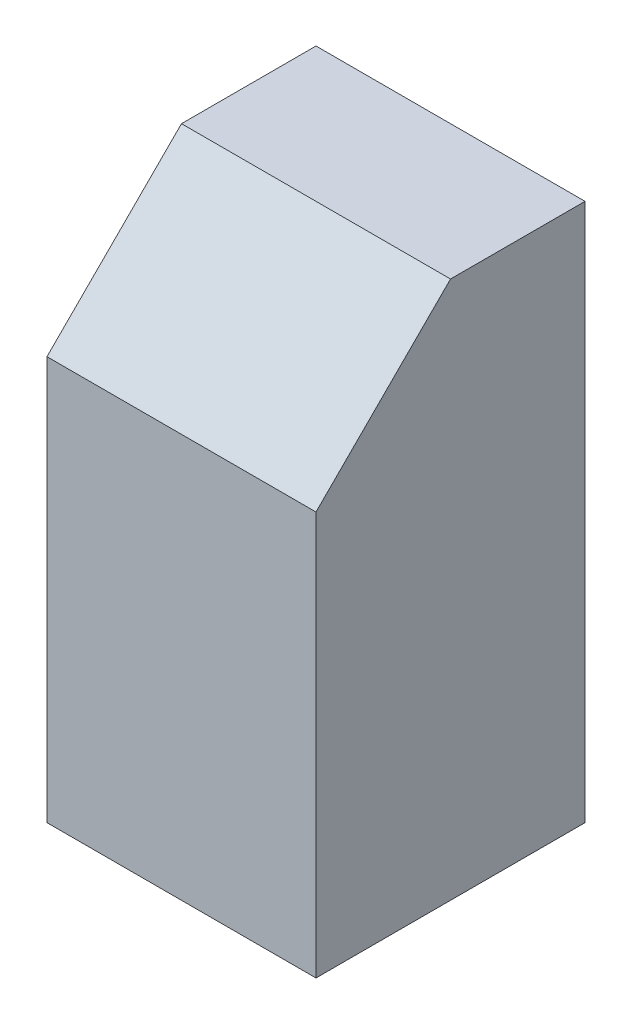
ISO-10303-21;
HEADER;
FILE_DESCRIPTION(('STEP AP214'),'2;1');
FILE_NAME('part.step','',(''),(''),'','','');
FILE_SCHEMA(('AUTOMOTIVE_DESIGN { 1 0 10303 214 1 1 1 1 }'));
ENDSEC;
DATA;
#1=APPLICATION_CONTEXT('core data for automotive mechanical design processes');
#2=APPLICATION_PROTOCOL_DEFINITION('international standard','automotive_design',2000,#1);
#3=PRODUCT_CONTEXT('',#1,'mechanical');
#4=PRODUCT('Part','Part','',(#3));
#5=PRODUCT_RELATED_PRODUCT_CATEGORY('part','',(#4));
#6=PRODUCT_DEFINITION_FORMATION('','',#4);
#7=PRODUCT_DEFINITION_CONTEXT('part definition',#1,'design');
#8=PRODUCT_DEFINITION('design','',#6,#7);
#9=PRODUCT_DEFINITION_SHAPE('','',#8);
#10=(LENGTH_UNIT() NAMED_UNIT(*) SI_UNIT(.MILLI.,.METRE.));
#11=(NAMED_UNIT(*) PLANE_ANGLE_UNIT() SI_UNIT($,.RADIAN.));
#12=(NAMED_UNIT(*) SI_UNIT($,.STERADIAN.) SOLID_ANGLE_UNIT());
#13=UNCERTAINTY_MEASURE_WITH_UNIT(LENGTH_MEASURE(1.E-05),#10,'distance_accuracy_value','');
#14=(GEOMETRIC_REPRESENTATION_CONTEXT(3) GLOBAL_UNCERTAINTY_ASSIGNED_CONTEXT((#13)) GLOBAL_UNIT_ASSIGNED_CONTEXT((#10,
#11,#12)) REPRESENTATION_CONTEXT('',''));
#15=CARTESIAN_POINT('',(0.,0.,0.));
#16=DIRECTION('',(0.,0.,1.));
#17=DIRECTION('',(1.,0.,0.));
#18=AXIS2_PLACEMENT_3D('',#15,#16,#17);
#19=CARTESIAN_POINT('',(250.,1000.,250.));
#20=DIRECTION('',(-1.,0.,0.));
#21=DIRECTION('',(0.,0.,1.));
#22=AXIS2_PLACEMENT_3D('',#19,#20,#21);
#23=PLANE('',#22);
#24=DIRECTION('',(0.,-0.707106781186547,0.707106781186548));
#25=VECTOR('',#24,1.);
#26=CARTESIAN_POINT('',(250.,500.000000000001,500.));
#27=LINE('',#26,#25);
#28=CARTESIAN_POINT('',(250.,1000.,0.));
#29=VERTEX_POINT('',#28);
#30=CARTESIAN_POINT('',(250.,750.000000000001,250.));
#31=VERTEX_POINT('',#30);
#32=EDGE_CURVE('E49',#29,#31,#27,.T.);
#33=ORIENTED_EDGE('',*,*,#32,.T.);
#34=DIRECTION('',(0.,-1.,0.));
#35=VECTOR('',#34,1.);
#36=CARTESIAN_POINT('',(250.,1000.,250.));
#37=LINE('',#36,#35);
#38=CARTESIAN_POINT('',(250.,0.,250.));
#39=VERTEX_POINT('',#38);
#40=EDGE_CURVE('E77',#31,#39,#37,.T.);
#41=ORIENTED_EDGE('',*,*,#40,.T.);
#42=DIRECTION('',(0.,0.,-1.));
#43=VECTOR('',#42,1.);
#44=CARTESIAN_POINT('',(250.,0.,250.));
#45=LINE('',#44,#43);
#46=CARTESIAN_POINT('',(250.,0.,-250.));
#47=VERTEX_POINT('',#46);
#48=EDGE_CURVE('E81',#39,#47,#45,.T.);
#49=ORIENTED_EDGE('',*,*,#48,.T.);
#50=DIRECTION('',(0.,-1.,0.));
#51=VECTOR('',#50,1.);
#52=CARTESIAN_POINT('',(250.,1000.,-250.));
#53=LINE('',#52,#51);
#54=CARTESIAN_POINT('',(250.,1000.,-250.));
#55=VERTEX_POINT('',#54);
#56=EDGE_CURVE('E11',#55,#47,#53,.T.);
#57=ORIENTED_EDGE('',*,*,#56,.F.);
#58=DIRECTION('',(0.,0.,-1.));
#59=VECTOR('',#58,1.);
#60=CARTESIAN_POINT('',(250.,1000.,250.));
#61=LINE('',#60,#59);
#62=EDGE_CURVE('E96',#29,#55,#61,.T.);
#63=ORIENTED_EDGE('',*,*,#62,.F.);
#64=EDGE_LOOP('',(#33,#41,#49,#57,#63));
#65=FACE_BOUND('',#64,.T.);
#66=ADVANCED_FACE('F35',(#65),#23,.F.);
#67=CARTESIAN_POINT('',(-250.,1000.,250.));
#68=DIRECTION('',(1.,0.,0.));
#69=DIRECTION('',(0.,0.,-1.));
#70=AXIS2_PLACEMENT_3D('',#67,#68,#69);
#71=PLANE('',#70);
#72=DIRECTION('',(0.,0.707106781186547,-0.707106781186548));
#73=VECTOR('',#72,1.);
#74=CARTESIAN_POINT('',(-250.,500.000000000001,500.));
#75=LINE('',#74,#73);
#76=CARTESIAN_POINT('',(-250.,750.000000000001,250.));
#77=VERTEX_POINT('',#76);
#78=CARTESIAN_POINT('',(-250.,1000.,0.));
#79=VERTEX_POINT('',#78);
#80=EDGE_CURVE('E121',#77,#79,#75,.T.);
#81=ORIENTED_EDGE('',*,*,#80,.T.);
#82=DIRECTION('',(0.,0.,1.));
#83=VECTOR('',#82,1.);
#84=CARTESIAN_POINT('',(-250.,1000.,250.));
#85=LINE('',#84,#83);
#86=CARTESIAN_POINT('',(-250.,1000.,-250.));
#87=VERTEX_POINT('',#86);
#88=EDGE_CURVE('E87',#87,#79,#85,.T.);
#89=ORIENTED_EDGE('',*,*,#88,.F.);
#90=DIRECTION('',(0.,-1.,0.));
#91=VECTOR('',#90,1.);
#92=CARTESIAN_POINT('',(-250.,1000.,-250.));
#93=LINE('',#92,#91);
#94=CARTESIAN_POINT('',(-250.,0.,-250.));
#95=VERTEX_POINT('',#94);
#96=EDGE_CURVE('E42',#87,#95,#93,.T.);
#97=ORIENTED_EDGE('',*,*,#96,.T.);
#98=DIRECTION('',(0.,0.,1.));
#99=VECTOR('',#98,1.);
#100=CARTESIAN_POINT('',(-250.,0.,250.));
#101=LINE('',#100,#99);
#102=CARTESIAN_POINT('',(-250.,0.,250.));
#103=VERTEX_POINT('',#102);
#104=EDGE_CURVE('E97',#95,#103,#101,.T.);
#105=ORIENTED_EDGE('',*,*,#104,.T.);
#106=DIRECTION('',(0.,-1.,0.));
#107=VECTOR('',#106,1.);
#108=CARTESIAN_POINT('',(-250.,1000.,250.));
#109=LINE('',#108,#107);
#110=EDGE_CURVE('E86',#77,#103,#109,.T.);
#111=ORIENTED_EDGE('',*,*,#110,.F.);
#112=EDGE_LOOP('',(#81,#89,#97,#105,#111));
#113=FACE_BOUND('',#112,.T.);
#114=ADVANCED_FACE('F114',(#113),#71,.F.);
#115=CARTESIAN_POINT('',(-250.,1000.,250.));
#116=DIRECTION('',(0.,0.,-1.));
#117=DIRECTION('',(-1.,0.,0.));
#118=AXIS2_PLACEMENT_3D('',#115,#116,#117);
#119=PLANE('',#118);
#120=DIRECTION('',(1.,0.,0.));
#121=VECTOR('',#120,1.);
#122=CARTESIAN_POINT('',(-250.001,750.000000000001,250.));
#123=LINE('',#122,#121);
#124=EDGE_CURVE('E101',#77,#31,#123,.T.);
#125=ORIENTED_EDGE('',*,*,#124,.F.);
#126=ORIENTED_EDGE('',*,*,#110,.T.);
#127=DIRECTION('',(1.,0.,0.));
#128=VECTOR('',#127,1.);
#129=CARTESIAN_POINT('',(-250.,0.,250.));
#130=LINE('',#129,#128);
#131=EDGE_CURVE('E90',#103,#39,#130,.T.);
#132=ORIENTED_EDGE('',*,*,#131,.T.);
#133=ORIENTED_EDGE('',*,*,#40,.F.);
#134=EDGE_LOOP('',(#125,#126,#132,#133));
#135=FACE_BOUND('',#134,.T.);
#136=ADVANCED_FACE('F91',(#135),#119,.F.);
#137=CARTESIAN_POINT('',(0.,1000.,0.));
#138=DIRECTION('',(0.,-1.,0.));
#139=DIRECTION('',(0.,0.,-1.));
#140=AXIS2_PLACEMENT_3D('',#137,#138,#139);
#141=PLANE('',#140);
#142=DIRECTION('',(1.,0.,0.));
#143=VECTOR('',#142,1.);
#144=CARTESIAN_POINT('',(-250.001,1000.,0.));
#145=LINE('',#144,#143);
#146=EDGE_CURVE('E104',#79,#29,#145,.T.);
#147=ORIENTED_EDGE('',*,*,#146,.T.);
#148=ORIENTED_EDGE('',*,*,#62,.T.);
#149=DIRECTION('',(-1.,0.,0.));
#150=VECTOR('',#149,1.);
#151=CARTESIAN_POINT('',(-250.,1000.,-250.));
#152=LINE('',#151,#150);
#153=EDGE_CURVE('E58',#55,#87,#152,.T.);
#154=ORIENTED_EDGE('',*,*,#153,.T.);
#155=ORIENTED_EDGE('',*,*,#88,.T.);
#156=EDGE_LOOP('',(#147,#148,#154,#155));
#157=FACE_BOUND('',#156,.T.);
#158=ADVANCED_FACE('F125',(#157),#141,.F.);
#159=CARTESIAN_POINT('',(-250.,1000.,-250.));
#160=DIRECTION('',(0.,0.,1.));
#161=DIRECTION('',(1.,0.,0.));
#162=AXIS2_PLACEMENT_3D('',#159,#160,#161);
#163=PLANE('',#162);
#164=DIRECTION('',(-1.,0.,0.));
#165=VECTOR('',#164,1.);
#166=CARTESIAN_POINT('',(-250.,0.,-250.));
#167=LINE('',#166,#165);
#168=EDGE_CURVE('E100',#47,#95,#167,.T.);
#169=ORIENTED_EDGE('',*,*,#168,.T.);
#170=ORIENTED_EDGE('',*,*,#96,.F.);
#171=ORIENTED_EDGE('',*,*,#153,.F.);
#172=ORIENTED_EDGE('',*,*,#56,.T.);
#173=EDGE_LOOP('',(#169,#170,#171,#172));
#174=FACE_BOUND('',#173,.T.);
#175=ADVANCED_FACE('F116',(#174),#163,.F.);
#176=CARTESIAN_POINT('',(0.,0.,0.));
#177=DIRECTION('',(0.,-1.,0.));
#178=DIRECTION('',(0.,0.,-1.));
#179=AXIS2_PLACEMENT_3D('',#176,#177,#178);
#180=PLANE('',#179);
#181=ORIENTED_EDGE('',*,*,#48,.F.);
#182=ORIENTED_EDGE('',*,*,#131,.F.);
#183=ORIENTED_EDGE('',*,*,#104,.F.);
#184=ORIENTED_EDGE('',*,*,#168,.F.);
#185=EDGE_LOOP('',(#181,#182,#183,#184));
#186=FACE_BOUND('',#185,.T.);
#187=ADVANCED_FACE('F99',(#186),#180,.T.);
#188=CARTESIAN_POINT('',(-250.001,500.000000000001,500.));
#189=DIRECTION('',(0.,0.707106781186548,0.707106781186547));
#190=DIRECTION('',(0.,-0.707106781186547,0.707106781186548));
#191=AXIS2_PLACEMENT_3D('',#188,#189,#190);
#192=PLANE('',#191);
#193=ORIENTED_EDGE('',*,*,#124,.T.);
#194=ORIENTED_EDGE('',*,*,#32,.F.);
#195=ORIENTED_EDGE('',*,*,#146,.F.);
#196=ORIENTED_EDGE('',*,*,#80,.F.);
#197=EDGE_LOOP('',(#193,#194,#195,#196));
#198=FACE_BOUND('',#197,.T.);
#199=ADVANCED_FACE('F126',(#198),#192,.T.);
#200=CLOSED_SHELL('',(#66,#114,#136,#158,#175,#187,#199));
#201=MANIFOLD_SOLID_BREP('B2',#200);
#202=ADVANCED_BREP_SHAPE_REPRESENTATION('',(#18,#201),#14);
#203=SHAPE_DEFINITION_REPRESENTATION(#9,#202);
ENDSEC;
END-ISO-10303-21;
